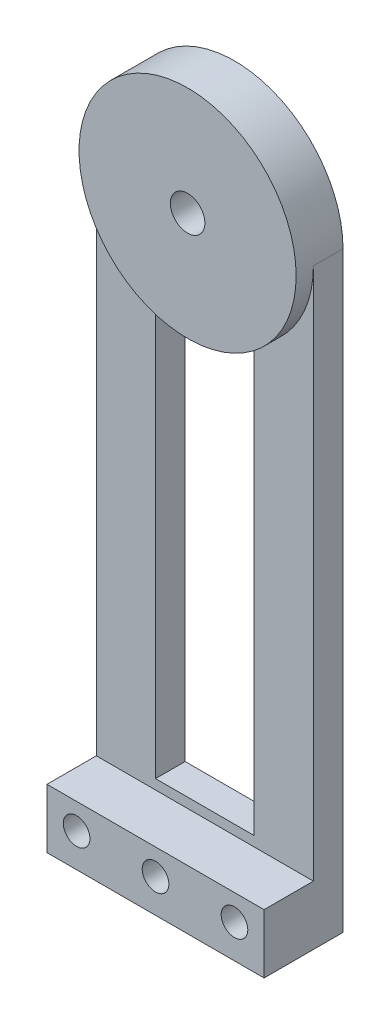
ISO-10303-21;
HEADER;
FILE_DESCRIPTION(('STEP AP214'),'2;1');
FILE_NAME('part.step','',(''),(''),'','','');
FILE_SCHEMA(('AUTOMOTIVE_DESIGN { 1 0 10303 214 1 1 1 1 }'));
ENDSEC;
DATA;
#1=APPLICATION_CONTEXT('core data for automotive mechanical design processes');
#2=APPLICATION_PROTOCOL_DEFINITION('international standard','automotive_design',2000,#1);
#3=PRODUCT_CONTEXT('',#1,'mechanical');
#4=PRODUCT('Part','Part','',(#3));
#5=PRODUCT_RELATED_PRODUCT_CATEGORY('part','',(#4));
#6=PRODUCT_DEFINITION_FORMATION('','',#4);
#7=PRODUCT_DEFINITION_CONTEXT('part definition',#1,'design');
#8=PRODUCT_DEFINITION('design','',#6,#7);
#9=PRODUCT_DEFINITION_SHAPE('','',#8);
#10=(LENGTH_UNIT() NAMED_UNIT(*) SI_UNIT(.MILLI.,.METRE.));
#11=(NAMED_UNIT(*) PLANE_ANGLE_UNIT() SI_UNIT($,.RADIAN.));
#12=(NAMED_UNIT(*) SI_UNIT($,.STERADIAN.) SOLID_ANGLE_UNIT());
#13=UNCERTAINTY_MEASURE_WITH_UNIT(LENGTH_MEASURE(1.E-05),#10,'distance_accuracy_value','');
#14=(GEOMETRIC_REPRESENTATION_CONTEXT(3) GLOBAL_UNCERTAINTY_ASSIGNED_CONTEXT((#13)) GLOBAL_UNIT_ASSIGNED_CONTEXT((#10,
#11,#12)) REPRESENTATION_CONTEXT('',''));
#15=CARTESIAN_POINT('',(0.,0.,0.));
#16=DIRECTION('',(0.,0.,1.));
#17=DIRECTION('',(1.,0.,0.));
#18=AXIS2_PLACEMENT_3D('',#15,#16,#17);
#19=CARTESIAN_POINT('',(0.,0.,0.));
#20=DIRECTION('',(0.,0.,-1.));
#21=DIRECTION('',(1.,0.,0.));
#22=AXIS2_PLACEMENT_3D('',#19,#20,#21);
#23=PLANE('',#22);
#24=CARTESIAN_POINT('',(0.,30.,0.));
#25=DIRECTION('',(0.,0.,1.));
#26=DIRECTION('',(1.,0.,0.));
#27=AXIS2_PLACEMENT_3D('',#24,#25,#26);
#28=CIRCLE('',#27,11.5);
#29=CARTESIAN_POINT('',(-5.,19.643842411396,0.));
#30=VERTEX_POINT('',#29);
#31=CARTESIAN_POINT('',(5.,19.643842411396,0.));
#32=VERTEX_POINT('',#31);
#33=EDGE_CURVE('E158',#30,#32,#28,.T.);
#34=ORIENTED_EDGE('',*,*,#33,.T.);
#35=DIRECTION('',(0.,-1.,0.));
#36=VECTOR('',#35,1.);
#37=CARTESIAN_POINT('',(5.,0.,0.));
#38=LINE('',#37,#36);
#39=CARTESIAN_POINT('',(5.00000000000001,-23.,0.));
#40=VERTEX_POINT('',#39);
#41=EDGE_CURVE('E176',#32,#40,#38,.T.);
#42=ORIENTED_EDGE('',*,*,#41,.T.);
#43=DIRECTION('',(1.,0.,0.));
#44=VECTOR('',#43,1.);
#45=CARTESIAN_POINT('',(0.,-23.,0.));
#46=LINE('',#45,#44);
#47=CARTESIAN_POINT('',(-5.00000000000001,-23.,0.));
#48=VERTEX_POINT('',#47);
#49=EDGE_CURVE('E230',#48,#40,#46,.T.);
#50=ORIENTED_EDGE('',*,*,#49,.F.);
#51=DIRECTION('',(0.,-1.,0.));
#52=VECTOR('',#51,1.);
#53=CARTESIAN_POINT('',(-5.,0.,0.));
#54=LINE('',#53,#52);
#55=EDGE_CURVE('E233',#30,#48,#54,.T.);
#56=ORIENTED_EDGE('',*,*,#55,.F.);
#57=EDGE_LOOP('',(#34,#42,#50,#56));
#58=FACE_BOUND('',#57,.T.);
#59=DIRECTION('',(1.,0.,0.));
#60=VECTOR('',#59,1.);
#61=CARTESIAN_POINT('',(0.,-24.,0.));
#62=LINE('',#61,#60);
#63=CARTESIAN_POINT('',(-11.,-24.,0.));
#64=VERTEX_POINT('',#63);
#65=CARTESIAN_POINT('',(11.,-24.,0.));
#66=VERTEX_POINT('',#65);
#67=EDGE_CURVE('E204',#64,#66,#62,.T.);
#68=ORIENTED_EDGE('',*,*,#67,.T.);
#69=DIRECTION('',(0.,-1.,0.));
#70=VECTOR('',#69,1.);
#71=CARTESIAN_POINT('',(11.,0.,0.));
#72=LINE('',#71,#70);
#73=CARTESIAN_POINT('',(11.,30.,0.));
#74=VERTEX_POINT('',#73);
#75=EDGE_CURVE('E235',#74,#66,#72,.T.);
#76=ORIENTED_EDGE('',*,*,#75,.F.);
#77=CARTESIAN_POINT('',(0.,30.,0.));
#78=DIRECTION('',(0.,0.,1.));
#79=DIRECTION('',(1.,0.,0.));
#80=AXIS2_PLACEMENT_3D('',#77,#78,#79);
#81=CIRCLE('',#80,11.);
#82=CARTESIAN_POINT('',(-11.,30.,0.));
#83=VERTEX_POINT('',#82);
#84=EDGE_CURVE('E13',#83,#74,#81,.T.);
#85=ORIENTED_EDGE('',*,*,#84,.F.);
#86=DIRECTION('',(0.,-1.,0.));
#87=VECTOR('',#86,1.);
#88=CARTESIAN_POINT('',(-11.,0.,0.));
#89=LINE('',#88,#87);
#90=EDGE_CURVE('E153',#83,#64,#89,.T.);
#91=ORIENTED_EDGE('',*,*,#90,.T.);
#92=EDGE_LOOP('',(#68,#76,#85,#91));
#93=FACE_BOUND('',#92,.T.);
#94=ADVANCED_FACE('F61',(#58,#93),#23,.F.);
#95=CARTESIAN_POINT('',(0.,30.,6.69974746830584));
#96=DIRECTION('',(0.,0.,-1.));
#97=DIRECTION('',(1.,0.,0.));
#98=AXIS2_PLACEMENT_3D('',#95,#96,#97);
#99=CYLINDRICAL_SURFACE('',#98,1.75);
#100=CARTESIAN_POINT('',(0.,30.,1.75));
#101=DIRECTION('',(0.,0.,1.));
#102=DIRECTION('',(1.,0.,0.));
#103=AXIS2_PLACEMENT_3D('',#100,#101,#102);
#104=CIRCLE('',#103,1.75);
#105=CARTESIAN_POINT('',(1.74999999999999,30.,1.75));
#106=VERTEX_POINT('',#105);
#107=EDGE_CURVE('E219',#106,#106,#104,.F.);
#108=ORIENTED_EDGE('',*,*,#107,.F.);
#109=EDGE_LOOP('',(#108));
#110=FACE_BOUND('',#109,.T.);
#111=CARTESIAN_POINT('',(0.,30.,-1.25));
#112=DIRECTION('',(0.,0.,1.));
#113=DIRECTION('',(1.,0.,0.));
#114=AXIS2_PLACEMENT_3D('',#111,#112,#113);
#115=CIRCLE('',#114,1.75);
#116=CARTESIAN_POINT('',(1.74999999999999,30.,-1.25));
#117=VERTEX_POINT('',#116);
#118=EDGE_CURVE('E209',#117,#117,#115,.F.);
#119=ORIENTED_EDGE('',*,*,#118,.T.);
#120=EDGE_LOOP('',(#119));
#121=FACE_BOUND('',#120,.T.);
#122=ADVANCED_FACE('F309',(#110,#121),#99,.F.);
#123=CARTESIAN_POINT('',(11.,0.,-3.));
#124=DIRECTION('',(1.,0.,0.));
#125=DIRECTION('',(0.,0.,1.));
#126=AXIS2_PLACEMENT_3D('',#123,#124,#125);
#127=PLANE('',#126);
#128=ORIENTED_EDGE('',*,*,#75,.T.);
#129=DIRECTION('',(0.,0.,-1.));
#130=VECTOR('',#129,1.);
#131=CARTESIAN_POINT('',(11.,-24.,5.));
#132=LINE('',#131,#130);
#133=CARTESIAN_POINT('',(11.,-24.,5.));
#134=VERTEX_POINT('',#133);
#135=EDGE_CURVE('E193',#134,#66,#132,.T.);
#136=ORIENTED_EDGE('',*,*,#135,.F.);
#137=DIRECTION('',(0.,-1.,0.));
#138=VECTOR('',#137,1.);
#139=CARTESIAN_POINT('',(11.,0.,5.));
#140=LINE('',#139,#138);
#141=CARTESIAN_POINT('',(11.,-30.,5.));
#142=VERTEX_POINT('',#141);
#143=EDGE_CURVE('E189',#134,#142,#140,.T.);
#144=ORIENTED_EDGE('',*,*,#143,.T.);
#145=DIRECTION('',(0.,0.,1.));
#146=VECTOR('',#145,1.);
#147=CARTESIAN_POINT('',(11.,-30.,-3.));
#148=LINE('',#147,#146);
#149=CARTESIAN_POINT('',(11.,-30.,-3.));
#150=VERTEX_POINT('',#149);
#151=EDGE_CURVE('E65',#150,#142,#148,.T.);
#152=ORIENTED_EDGE('',*,*,#151,.F.);
#153=DIRECTION('',(0.,-1.,0.));
#154=VECTOR('',#153,1.);
#155=CARTESIAN_POINT('',(11.,0.,-3.));
#156=LINE('',#155,#154);
#157=CARTESIAN_POINT('',(11.,30.,-3.));
#158=VERTEX_POINT('',#157);
#159=EDGE_CURVE('E143',#158,#150,#156,.T.);
#160=ORIENTED_EDGE('',*,*,#159,.F.);
#161=DIRECTION('',(0.,0.,1.));
#162=VECTOR('',#161,1.);
#163=CARTESIAN_POINT('',(11.,30.,-3.));
#164=LINE('',#163,#162);
#165=EDGE_CURVE('E71',#158,#74,#164,.T.);
#166=ORIENTED_EDGE('',*,*,#165,.T.);
#167=EDGE_LOOP('',(#128,#136,#144,#152,#160,#166));
#168=FACE_BOUND('',#167,.T.);
#169=ADVANCED_FACE('F191',(#168),#127,.T.);
#170=CARTESIAN_POINT('',(0.,30.,-3.));
#171=DIRECTION('',(0.,0.,1.));
#172=DIRECTION('',(-1.,0.,0.));
#173=AXIS2_PLACEMENT_3D('',#170,#171,#172);
#174=CYLINDRICAL_SURFACE('',#173,11.);
#175=ORIENTED_EDGE('',*,*,#165,.F.);
#176=CARTESIAN_POINT('',(0.,30.,-3.));
#177=DIRECTION('',(0.,0.,1.));
#178=DIRECTION('',(1.,0.,0.));
#179=AXIS2_PLACEMENT_3D('',#176,#177,#178);
#180=CIRCLE('',#179,11.);
#181=CARTESIAN_POINT('',(-11.,30.,-3.));
#182=VERTEX_POINT('',#181);
#183=EDGE_CURVE('E162',#158,#182,#180,.T.);
#184=ORIENTED_EDGE('',*,*,#183,.T.);
#185=DIRECTION('',(0.,0.,1.));
#186=VECTOR('',#185,1.);
#187=CARTESIAN_POINT('',(-11.,30.,-3.));
#188=LINE('',#187,#186);
#189=EDGE_CURVE('E114',#182,#83,#188,.T.);
#190=ORIENTED_EDGE('',*,*,#189,.T.);
#191=ORIENTED_EDGE('',*,*,#84,.T.);
#192=EDGE_LOOP('',(#175,#184,#190,#191));
#193=FACE_BOUND('',#192,.T.);
#194=CARTESIAN_POINT('',(0.,30.,1.75));
#195=DIRECTION('',(0.,0.,1.));
#196=DIRECTION('',(1.,0.,0.));
#197=AXIS2_PLACEMENT_3D('',#194,#195,#196);
#198=CIRCLE('',#197,11.);
#199=CARTESIAN_POINT('',(11.,30.,1.75));
#200=VERTEX_POINT('',#199);
#201=EDGE_CURVE('E170',#200,#200,#198,.T.);
#202=ORIENTED_EDGE('',*,*,#201,.F.);
#203=EDGE_LOOP('',(#202));
#204=FACE_BOUND('',#203,.T.);
#205=ADVANCED_FACE('F241',(#193,#204),#174,.T.);
#206=CARTESIAN_POINT('',(0.,30.,-3.));
#207=DIRECTION('',(0.,0.,1.));
#208=DIRECTION('',(-1.,0.,0.));
#209=AXIS2_PLACEMENT_3D('',#206,#207,#208);
#210=CYLINDRICAL_SURFACE('',#209,11.5);
#211=ORIENTED_EDGE('',*,*,#33,.F.);
#212=DIRECTION('',(0.,0.,1.));
#213=VECTOR('',#212,1.);
#214=CARTESIAN_POINT('',(-5.,19.643842411396,-3.));
#215=LINE('',#214,#213);
#216=CARTESIAN_POINT('',(-5.,19.643842411396,-3.));
#217=VERTEX_POINT('',#216);
#218=EDGE_CURVE('E138',#217,#30,#215,.T.);
#219=ORIENTED_EDGE('',*,*,#218,.F.);
#220=CARTESIAN_POINT('',(0.,30.,-3.));
#221=DIRECTION('',(0.,0.,1.));
#222=DIRECTION('',(1.,0.,0.));
#223=AXIS2_PLACEMENT_3D('',#220,#221,#222);
#224=CIRCLE('',#223,11.5);
#225=CARTESIAN_POINT('',(5.,19.643842411396,-3.));
#226=VERTEX_POINT('',#225);
#227=EDGE_CURVE('E147',#217,#226,#224,.T.);
#228=ORIENTED_EDGE('',*,*,#227,.T.);
#229=DIRECTION('',(0.,0.,1.));
#230=VECTOR('',#229,1.);
#231=CARTESIAN_POINT('',(5.,19.643842411396,-3.));
#232=LINE('',#231,#230);
#233=EDGE_CURVE('E168',#226,#32,#232,.T.);
#234=ORIENTED_EDGE('',*,*,#233,.T.);
#235=EDGE_LOOP('',(#211,#219,#228,#234));
#236=FACE_BOUND('',#235,.T.);
#237=ADVANCED_FACE('F156',(#236),#210,.T.);
#238=CARTESIAN_POINT('',(5.,0.,-3.));
#239=DIRECTION('',(1.,0.,0.));
#240=DIRECTION('',(0.,1.,0.));
#241=AXIS2_PLACEMENT_3D('',#238,#239,#240);
#242=PLANE('',#241);
#243=ORIENTED_EDGE('',*,*,#41,.F.);
#244=ORIENTED_EDGE('',*,*,#233,.F.);
#245=DIRECTION('',(0.,-1.,0.));
#246=VECTOR('',#245,1.);
#247=CARTESIAN_POINT('',(5.,0.,-3.));
#248=LINE('',#247,#246);
#249=CARTESIAN_POINT('',(5.00000000000001,-23.,-3.));
#250=VERTEX_POINT('',#249);
#251=EDGE_CURVE('E150',#226,#250,#248,.T.);
#252=ORIENTED_EDGE('',*,*,#251,.T.);
#253=DIRECTION('',(0.,0.,1.));
#254=VECTOR('',#253,1.);
#255=CARTESIAN_POINT('',(5.00000000000001,-23.,-3.));
#256=LINE('',#255,#254);
#257=EDGE_CURVE('E160',#250,#40,#256,.T.);
#258=ORIENTED_EDGE('',*,*,#257,.T.);
#259=EDGE_LOOP('',(#243,#244,#252,#258));
#260=FACE_BOUND('',#259,.T.);
#261=ADVANCED_FACE('F329',(#260),#242,.F.);
#262=CARTESIAN_POINT('',(0.,-23.,-3.));
#263=DIRECTION('',(0.,1.,0.));
#264=DIRECTION('',(0.,0.,-1.));
#265=AXIS2_PLACEMENT_3D('',#262,#263,#264);
#266=PLANE('',#265);
#267=ORIENTED_EDGE('',*,*,#49,.T.);
#268=ORIENTED_EDGE('',*,*,#257,.F.);
#269=DIRECTION('',(1.,0.,0.));
#270=VECTOR('',#269,1.);
#271=CARTESIAN_POINT('',(0.,-23.,-3.));
#272=LINE('',#271,#270);
#273=CARTESIAN_POINT('',(-5.00000000000001,-23.,-3.));
#274=VERTEX_POINT('',#273);
#275=EDGE_CURVE('E144',#274,#250,#272,.T.);
#276=ORIENTED_EDGE('',*,*,#275,.F.);
#277=DIRECTION('',(0.,0.,1.));
#278=VECTOR('',#277,1.);
#279=CARTESIAN_POINT('',(-5.00000000000001,-23.,-3.));
#280=LINE('',#279,#278);
#281=EDGE_CURVE('E140',#274,#48,#280,.T.);
#282=ORIENTED_EDGE('',*,*,#281,.T.);
#283=EDGE_LOOP('',(#267,#268,#276,#282));
#284=FACE_BOUND('',#283,.T.);
#285=ADVANCED_FACE('F326',(#284),#266,.T.);
#286=CARTESIAN_POINT('',(-5.,0.,-3.));
#287=DIRECTION('',(1.,0.,0.));
#288=DIRECTION('',(0.,1.,0.));
#289=AXIS2_PLACEMENT_3D('',#286,#287,#288);
#290=PLANE('',#289);
#291=ORIENTED_EDGE('',*,*,#55,.T.);
#292=ORIENTED_EDGE('',*,*,#281,.F.);
#293=DIRECTION('',(0.,-1.,0.));
#294=VECTOR('',#293,1.);
#295=CARTESIAN_POINT('',(-5.,0.,-3.));
#296=LINE('',#295,#294);
#297=EDGE_CURVE('E133',#217,#274,#296,.T.);
#298=ORIENTED_EDGE('',*,*,#297,.F.);
#299=ORIENTED_EDGE('',*,*,#218,.T.);
#300=EDGE_LOOP('',(#291,#292,#298,#299));
#301=FACE_BOUND('',#300,.T.);
#302=ADVANCED_FACE('F136',(#301),#290,.T.);
#303=CARTESIAN_POINT('',(-11.,0.,-3.));
#304=DIRECTION('',(1.,0.,0.));
#305=DIRECTION('',(0.,0.,1.));
#306=AXIS2_PLACEMENT_3D('',#303,#304,#305);
#307=PLANE('',#306);
#308=ORIENTED_EDGE('',*,*,#90,.F.);
#309=ORIENTED_EDGE('',*,*,#189,.F.);
#310=DIRECTION('',(0.,-1.,0.));
#311=VECTOR('',#310,1.);
#312=CARTESIAN_POINT('',(-11.,0.,-3.));
#313=LINE('',#312,#311);
#314=CARTESIAN_POINT('',(-11.,-30.,-3.));
#315=VERTEX_POINT('',#314);
#316=EDGE_CURVE('E80',#182,#315,#313,.T.);
#317=ORIENTED_EDGE('',*,*,#316,.T.);
#318=DIRECTION('',(0.,0.,1.));
#319=VECTOR('',#318,1.);
#320=CARTESIAN_POINT('',(-11.,-30.,-3.));
#321=LINE('',#320,#319);
#322=CARTESIAN_POINT('',(-11.,-30.,5.));
#323=VERTEX_POINT('',#322);
#324=EDGE_CURVE('E171',#315,#323,#321,.T.);
#325=ORIENTED_EDGE('',*,*,#324,.T.);
#326=DIRECTION('',(0.,-1.,0.));
#327=VECTOR('',#326,1.);
#328=CARTESIAN_POINT('',(-11.,0.,5.));
#329=LINE('',#328,#327);
#330=CARTESIAN_POINT('',(-11.,-24.,5.));
#331=VERTEX_POINT('',#330);
#332=EDGE_CURVE('E200',#331,#323,#329,.T.);
#333=ORIENTED_EDGE('',*,*,#332,.F.);
#334=DIRECTION('',(0.,0.,-1.));
#335=VECTOR('',#334,1.);
#336=CARTESIAN_POINT('',(-11.,-24.,5.));
#337=LINE('',#336,#335);
#338=EDGE_CURVE('E196',#331,#64,#337,.T.);
#339=ORIENTED_EDGE('',*,*,#338,.T.);
#340=EDGE_LOOP('',(#308,#309,#317,#325,#333,#339));
#341=FACE_BOUND('',#340,.T.);
#342=ADVANCED_FACE('F284',(#341),#307,.F.);
#343=CARTESIAN_POINT('',(0.,0.,-3.));
#344=DIRECTION('',(0.,0.,-1.));
#345=DIRECTION('',(1.,0.,0.));
#346=AXIS2_PLACEMENT_3D('',#343,#344,#345);
#347=PLANE('',#346);
#348=CARTESIAN_POINT('',(8.,-26.6,-3.));
#349=DIRECTION('',(0.,0.,1.));
#350=DIRECTION('',(1.,0.,0.));
#351=AXIS2_PLACEMENT_3D('',#348,#349,#350);
#352=CIRCLE('',#351,1.35);
#353=CARTESIAN_POINT('',(9.35,-26.6,-3.));
#354=VERTEX_POINT('',#353);
#355=EDGE_CURVE('E260',#354,#354,#352,.T.);
#356=ORIENTED_EDGE('',*,*,#355,.T.);
#357=EDGE_LOOP('',(#356));
#358=FACE_BOUND('',#357,.T.);
#359=CARTESIAN_POINT('',(-8.,-26.6,-3.));
#360=DIRECTION('',(0.,0.,1.));
#361=DIRECTION('',(1.,0.,0.));
#362=AXIS2_PLACEMENT_3D('',#359,#360,#361);
#363=CIRCLE('',#362,1.35);
#364=CARTESIAN_POINT('',(-6.65,-26.6,-3.));
#365=VERTEX_POINT('',#364);
#366=EDGE_CURVE('E261',#365,#365,#363,.T.);
#367=ORIENTED_EDGE('',*,*,#366,.T.);
#368=EDGE_LOOP('',(#367));
#369=FACE_BOUND('',#368,.T.);
#370=CARTESIAN_POINT('',(0.,-26.6,-3.));
#371=DIRECTION('',(0.,0.,1.));
#372=DIRECTION('',(1.,0.,0.));
#373=AXIS2_PLACEMENT_3D('',#370,#371,#372);
#374=CIRCLE('',#373,1.35);
#375=CARTESIAN_POINT('',(1.35,-26.6,-3.));
#376=VERTEX_POINT('',#375);
#377=EDGE_CURVE('E257',#376,#376,#374,.T.);
#378=ORIENTED_EDGE('',*,*,#377,.T.);
#379=EDGE_LOOP('',(#378));
#380=FACE_BOUND('',#379,.T.);
#381=CARTESIAN_POINT('',(0.,30.,-3.));
#382=DIRECTION('',(0.,0.,1.));
#383=DIRECTION('',(1.,0.,0.));
#384=AXIS2_PLACEMENT_3D('',#381,#382,#383);
#385=CIRCLE('',#384,3.);
#386=CARTESIAN_POINT('',(2.99999999999999,30.,-3.));
#387=VERTEX_POINT('',#386);
#388=EDGE_CURVE('E211',#387,#387,#385,.T.);
#389=ORIENTED_EDGE('',*,*,#388,.T.);
#390=EDGE_LOOP('',(#389));
#391=FACE_BOUND('',#390,.T.);
#392=ORIENTED_EDGE('',*,*,#227,.F.);
#393=ORIENTED_EDGE('',*,*,#297,.T.);
#394=ORIENTED_EDGE('',*,*,#275,.T.);
#395=ORIENTED_EDGE('',*,*,#251,.F.);
#396=EDGE_LOOP('',(#392,#393,#394,#395));
#397=FACE_BOUND('',#396,.T.);
#398=ORIENTED_EDGE('',*,*,#316,.F.);
#399=ORIENTED_EDGE('',*,*,#183,.F.);
#400=ORIENTED_EDGE('',*,*,#159,.T.);
#401=DIRECTION('',(1.,0.,0.));
#402=VECTOR('',#401,1.);
#403=CARTESIAN_POINT('',(-11.,-30.,-3.));
#404=LINE('',#403,#402);
#405=EDGE_CURVE('E107',#315,#150,#404,.T.);
#406=ORIENTED_EDGE('',*,*,#405,.F.);
#407=EDGE_LOOP('',(#398,#399,#400,#406));
#408=FACE_BOUND('',#407,.T.);
#409=ADVANCED_FACE('F148',(#358,#369,#380,#391,#397,#408),#347,.T.);
#410=CARTESIAN_POINT('',(-11.,-30.,-3.));
#411=DIRECTION('',(0.,1.,0.));
#412=DIRECTION('',(0.,0.,-1.));
#413=AXIS2_PLACEMENT_3D('',#410,#411,#412);
#414=PLANE('',#413);
#415=ORIENTED_EDGE('',*,*,#324,.F.);
#416=ORIENTED_EDGE('',*,*,#405,.T.);
#417=ORIENTED_EDGE('',*,*,#151,.T.);
#418=DIRECTION('',(1.,0.,0.));
#419=VECTOR('',#418,1.);
#420=CARTESIAN_POINT('',(0.,-30.,5.));
#421=LINE('',#420,#419);
#422=EDGE_CURVE('E182',#323,#142,#421,.T.);
#423=ORIENTED_EDGE('',*,*,#422,.F.);
#424=EDGE_LOOP('',(#415,#416,#417,#423));
#425=FACE_BOUND('',#424,.T.);
#426=ADVANCED_FACE('F63',(#425),#414,.F.);
#427=CARTESIAN_POINT('',(0.,0.,1.75));
#428=DIRECTION('',(0.,0.,-1.));
#429=DIRECTION('',(1.,0.,0.));
#430=AXIS2_PLACEMENT_3D('',#427,#428,#429);
#431=PLANE('',#430);
#432=ORIENTED_EDGE('',*,*,#107,.T.);
#433=EDGE_LOOP('',(#432));
#434=FACE_BOUND('',#433,.T.);
#435=ORIENTED_EDGE('',*,*,#201,.T.);
#436=EDGE_LOOP('',(#435));
#437=FACE_BOUND('',#436,.T.);
#438=ADVANCED_FACE('F295',(#434,#437),#431,.F.);
#439=CARTESIAN_POINT('',(0.,30.,10.2352813742386));
#440=DIRECTION('',(0.,0.,-1.));
#441=DIRECTION('',(1.,0.,0.));
#442=AXIS2_PLACEMENT_3D('',#439,#440,#441);
#443=CYLINDRICAL_SURFACE('',#442,3.);
#444=CARTESIAN_POINT('',(0.,30.,-1.25));
#445=DIRECTION('',(0.,0.,1.));
#446=DIRECTION('',(1.,0.,0.));
#447=AXIS2_PLACEMENT_3D('',#444,#445,#446);
#448=CIRCLE('',#447,3.);
#449=CARTESIAN_POINT('',(2.99999999999999,30.,-1.25));
#450=VERTEX_POINT('',#449);
#451=EDGE_CURVE('E214',#450,#450,#448,.F.);
#452=ORIENTED_EDGE('',*,*,#451,.F.);
#453=EDGE_LOOP('',(#452));
#454=FACE_BOUND('',#453,.T.);
#455=ORIENTED_EDGE('',*,*,#388,.F.);
#456=EDGE_LOOP('',(#455));
#457=FACE_BOUND('',#456,.T.);
#458=ADVANCED_FACE('F292',(#454,#457),#443,.F.);
#459=CARTESIAN_POINT('',(0.,0.,-1.25));
#460=DIRECTION('',(0.,0.,-1.));
#461=DIRECTION('',(1.,0.,0.));
#462=AXIS2_PLACEMENT_3D('',#459,#460,#461);
#463=PLANE('',#462);
#464=ORIENTED_EDGE('',*,*,#451,.T.);
#465=EDGE_LOOP('',(#464));
#466=FACE_BOUND('',#465,.T.);
#467=ORIENTED_EDGE('',*,*,#118,.F.);
#468=EDGE_LOOP('',(#467));
#469=FACE_BOUND('',#468,.T.);
#470=ADVANCED_FACE('F294',(#466,#469),#463,.T.);
#471=CARTESIAN_POINT('',(0.,-24.,5.));
#472=DIRECTION('',(0.,-1.,0.));
#473=DIRECTION('',(0.,0.,1.));
#474=AXIS2_PLACEMENT_3D('',#471,#472,#473);
#475=PLANE('',#474);
#476=ORIENTED_EDGE('',*,*,#67,.F.);
#477=ORIENTED_EDGE('',*,*,#338,.F.);
#478=DIRECTION('',(1.,0.,0.));
#479=VECTOR('',#478,1.);
#480=CARTESIAN_POINT('',(0.,-24.,5.));
#481=LINE('',#480,#479);
#482=EDGE_CURVE('E207',#331,#134,#481,.T.);
#483=ORIENTED_EDGE('',*,*,#482,.T.);
#484=ORIENTED_EDGE('',*,*,#135,.T.);
#485=EDGE_LOOP('',(#476,#477,#483,#484));
#486=FACE_BOUND('',#485,.T.);
#487=ADVANCED_FACE('F249',(#486),#475,.F.);
#488=CARTESIAN_POINT('',(0.,0.,5.));
#489=DIRECTION('',(0.,0.,-1.));
#490=DIRECTION('',(1.,0.,0.));
#491=AXIS2_PLACEMENT_3D('',#488,#489,#490);
#492=PLANE('',#491);
#493=CARTESIAN_POINT('',(8.,-26.6,5.));
#494=DIRECTION('',(0.,0.,1.));
#495=DIRECTION('',(1.,0.,0.));
#496=AXIS2_PLACEMENT_3D('',#493,#494,#495);
#497=CIRCLE('',#496,1.35);
#498=CARTESIAN_POINT('',(9.35,-26.6,5.));
#499=VERTEX_POINT('',#498);
#500=EDGE_CURVE('E264',#499,#499,#497,.F.);
#501=ORIENTED_EDGE('',*,*,#500,.T.);
#502=EDGE_LOOP('',(#501));
#503=FACE_BOUND('',#502,.T.);
#504=CARTESIAN_POINT('',(-8.,-26.6,5.));
#505=DIRECTION('',(0.,0.,1.));
#506=DIRECTION('',(1.,0.,0.));
#507=AXIS2_PLACEMENT_3D('',#504,#505,#506);
#508=CIRCLE('',#507,1.35);
#509=CARTESIAN_POINT('',(-6.65,-26.6,5.));
#510=VERTEX_POINT('',#509);
#511=EDGE_CURVE('E265',#510,#510,#508,.F.);
#512=ORIENTED_EDGE('',*,*,#511,.T.);
#513=EDGE_LOOP('',(#512));
#514=FACE_BOUND('',#513,.T.);
#515=CARTESIAN_POINT('',(0.,-26.6,5.));
#516=DIRECTION('',(0.,0.,1.));
#517=DIRECTION('',(1.,0.,0.));
#518=AXIS2_PLACEMENT_3D('',#515,#516,#517);
#519=CIRCLE('',#518,1.35);
#520=CARTESIAN_POINT('',(1.35,-26.6,5.));
#521=VERTEX_POINT('',#520);
#522=EDGE_CURVE('E208',#521,#521,#519,.F.);
#523=ORIENTED_EDGE('',*,*,#522,.T.);
#524=EDGE_LOOP('',(#523));
#525=FACE_BOUND('',#524,.T.);
#526=ORIENTED_EDGE('',*,*,#482,.F.);
#527=ORIENTED_EDGE('',*,*,#332,.T.);
#528=ORIENTED_EDGE('',*,*,#422,.T.);
#529=ORIENTED_EDGE('',*,*,#143,.F.);
#530=EDGE_LOOP('',(#526,#527,#528,#529));
#531=FACE_BOUND('',#530,.T.);
#532=ADVANCED_FACE('F252',(#503,#514,#525,#531),#492,.F.);
#533=CARTESIAN_POINT('',(0.,-26.6,8.81837661840736));
#534=DIRECTION('',(0.,0.,-1.));
#535=DIRECTION('',(1.,0.,0.));
#536=AXIS2_PLACEMENT_3D('',#533,#534,#535);
#537=CYLINDRICAL_SURFACE('',#536,1.35);
#538=CARTESIAN_POINT('',(1.35,-26.6,5.));
#539=CARTESIAN_POINT('',(1.35,-26.6,4.91666666666667));
#540=CARTESIAN_POINT('',(1.35,-26.6,4.83333333333333));
#541=CARTESIAN_POINT('',(1.35,-26.6,4.66666666666667));
#542=CARTESIAN_POINT('',(1.35,-26.6,4.58333333333333));
#543=CARTESIAN_POINT('',(1.35,-26.6,4.41666666666667));
#544=CARTESIAN_POINT('',(1.35,-26.6,4.33333333333333));
#545=CARTESIAN_POINT('',(1.35,-26.6,4.16666666666667));
#546=CARTESIAN_POINT('',(1.35,-26.6,4.08333333333333));
#547=CARTESIAN_POINT('',(1.35,-26.6,3.91666666666667));
#548=CARTESIAN_POINT('',(1.35,-26.6,3.83333333333333));
#549=CARTESIAN_POINT('',(1.35,-26.6,3.66666666666667));
#550=CARTESIAN_POINT('',(1.35,-26.6,3.58333333333333));
#551=CARTESIAN_POINT('',(1.35,-26.6,3.41666666666667));
#552=CARTESIAN_POINT('',(1.35,-26.6,3.33333333333333));
#553=CARTESIAN_POINT('',(1.35,-26.6,3.16666666666667));
#554=CARTESIAN_POINT('',(1.35,-26.6,3.08333333333333));
#555=CARTESIAN_POINT('',(1.35,-26.6,2.91666666666667));
#556=CARTESIAN_POINT('',(1.35,-26.6,2.83333333333333));
#557=CARTESIAN_POINT('',(1.35,-26.6,2.66666666666667));
#558=CARTESIAN_POINT('',(1.35,-26.6,2.58333333333333));
#559=CARTESIAN_POINT('',(1.35,-26.6,2.41666666666667));
#560=CARTESIAN_POINT('',(1.35,-26.6,2.33333333333333));
#561=CARTESIAN_POINT('',(1.35,-26.6,2.16666666666667));
#562=CARTESIAN_POINT('',(1.35,-26.6,2.08333333333333));
#563=CARTESIAN_POINT('',(1.35,-26.6,1.91666666666667));
#564=CARTESIAN_POINT('',(1.35,-26.6,1.83333333333333));
#565=CARTESIAN_POINT('',(1.35,-26.6,1.66666666666667));
#566=CARTESIAN_POINT('',(1.35,-26.6,1.58333333333333));
#567=CARTESIAN_POINT('',(1.35,-26.6,1.41666666666667));
#568=CARTESIAN_POINT('',(1.35,-26.6,1.33333333333333));
#569=CARTESIAN_POINT('',(1.35,-26.6,1.16666666666667));
#570=CARTESIAN_POINT('',(1.35,-26.6,1.08333333333333));
#571=CARTESIAN_POINT('',(1.35,-26.6,0.916666666666666));
#572=CARTESIAN_POINT('',(1.35,-26.6,0.833333333333332));
#573=CARTESIAN_POINT('',(1.35,-26.6,0.666666666666666));
#574=CARTESIAN_POINT('',(1.35,-26.6,0.583333333333332));
#575=CARTESIAN_POINT('',(1.35,-26.6,0.416666666666666));
#576=CARTESIAN_POINT('',(1.35,-26.6,0.333333333333333));
#577=CARTESIAN_POINT('',(1.35,-26.6,0.166666666666667));
#578=CARTESIAN_POINT('',(1.35,-26.6,0.0833333333333334));
#579=CARTESIAN_POINT('',(1.35,-26.6,-0.0833333333333334));
#580=CARTESIAN_POINT('',(1.35,-26.6,-0.166666666666667));
#581=CARTESIAN_POINT('',(1.35,-26.6,-0.333333333333334));
#582=CARTESIAN_POINT('',(1.35,-26.6,-0.416666666666667));
#583=CARTESIAN_POINT('',(1.35,-26.6,-0.583333333333334));
#584=CARTESIAN_POINT('',(1.35,-26.6,-0.666666666666667));
#585=CARTESIAN_POINT('',(1.35,-26.6,-0.833333333333334));
#586=CARTESIAN_POINT('',(1.35,-26.6,-0.916666666666668));
#587=CARTESIAN_POINT('',(1.35,-26.6,-1.08333333333333));
#588=CARTESIAN_POINT('',(1.35,-26.6,-1.16666666666667));
#589=CARTESIAN_POINT('',(1.35,-26.6,-1.33333333333333));
#590=CARTESIAN_POINT('',(1.35,-26.6,-1.41666666666667));
#591=CARTESIAN_POINT('',(1.35,-26.6,-1.58333333333333));
#592=CARTESIAN_POINT('',(1.35,-26.6,-1.66666666666667));
#593=CARTESIAN_POINT('',(1.35,-26.6,-1.83333333333333));
#594=CARTESIAN_POINT('',(1.35,-26.6,-1.91666666666667));
#595=CARTESIAN_POINT('',(1.35,-26.6,-2.08333333333333));
#596=CARTESIAN_POINT('',(1.35,-26.6,-2.16666666666667));
#597=CARTESIAN_POINT('',(1.35,-26.6,-2.33333333333333));
#598=CARTESIAN_POINT('',(1.35,-26.6,-2.41666666666667));
#599=CARTESIAN_POINT('',(1.35,-26.6,-2.58333333333333));
#600=CARTESIAN_POINT('',(1.35,-26.6,-2.66666666666667));
#601=CARTESIAN_POINT('',(1.35,-26.6,-2.83333333333333));
#602=CARTESIAN_POINT('',(1.35,-26.6,-2.91666666666667));
#603=CARTESIAN_POINT('',(1.35,-26.6,-3.));
#604=B_SPLINE_CURVE_WITH_KNOTS('',3,(#538,#539,#540,#541,#542,#543,#544,#545,#546,#547,#548,
#549,#550,#551,#552,#553,#554,#555,#556,#557,#558,#559,#560,#561,#562,#563,#564,#565,#566,#567,
#568,#569,#570,#571,#572,#573,#574,#575,#576,#577,#578,#579,#580,#581,#582,#583,#584,#585,#586,
#587,#588,#589,#590,#591,#592,#593,#594,#595,#596,#597,#598,#599,#600,#601,#602,#603),
.UNSPECIFIED.,.F.,.F.,(4,2,2,2,2,2,2,2,2,2,2,2,2,2,2,2,2,2,2,2,2,2,2,2,2,2,2,2,2,2,2,2,4),(0.,
0.249999999999999,0.5,0.75,0.999999999999999,1.25,1.5,1.75,2.,2.25,2.5,2.75,3.,3.25,3.5,3.75,4.,
4.25,4.5,4.75,5.,5.25,5.5,5.75,6.,6.25,6.5,6.75,7.,7.25,7.5,7.75,8.),.UNSPECIFIED.);
#605=EDGE_CURVE('BSEAM395',#521,#376,#604,.T.);
#606=ORIENTED_EDGE('',*,*,#522,.F.);
#607=ORIENTED_EDGE('',*,*,#377,.F.);
#608=ORIENTED_EDGE('',*,*,#605,.T.);
#609=ORIENTED_EDGE('',*,*,#605,.F.);
#610=EDGE_LOOP('',(#606,#608,#607,#609));
#611=FACE_BOUND('',#610,.T.);
#612=ADVANCED_FACE('F395',(#611),#537,.F.);
#613=CARTESIAN_POINT('',(-8.,-26.6,8.81837661840736));
#614=DIRECTION('',(0.,0.,-1.));
#615=DIRECTION('',(1.,0.,0.));
#616=AXIS2_PLACEMENT_3D('',#613,#614,#615);
#617=CYLINDRICAL_SURFACE('',#616,1.35);
#618=CARTESIAN_POINT('',(-6.65,-26.6,5.));
#619=CARTESIAN_POINT('',(-6.65,-26.6,4.91666666666667));
#620=CARTESIAN_POINT('',(-6.65,-26.6,4.83333333333333));
#621=CARTESIAN_POINT('',(-6.65,-26.6,4.66666666666667));
#622=CARTESIAN_POINT('',(-6.65,-26.6,4.58333333333333));
#623=CARTESIAN_POINT('',(-6.65,-26.6,4.41666666666667));
#624=CARTESIAN_POINT('',(-6.65,-26.6,4.33333333333333));
#625=CARTESIAN_POINT('',(-6.65,-26.6,4.16666666666667));
#626=CARTESIAN_POINT('',(-6.65,-26.6,4.08333333333333));
#627=CARTESIAN_POINT('',(-6.65,-26.6,3.91666666666667));
#628=CARTESIAN_POINT('',(-6.65,-26.6,3.83333333333333));
#629=CARTESIAN_POINT('',(-6.65,-26.6,3.66666666666667));
#630=CARTESIAN_POINT('',(-6.65,-26.6,3.58333333333333));
#631=CARTESIAN_POINT('',(-6.65,-26.6,3.41666666666667));
#632=CARTESIAN_POINT('',(-6.65,-26.6,3.33333333333333));
#633=CARTESIAN_POINT('',(-6.65,-26.6,3.16666666666667));
#634=CARTESIAN_POINT('',(-6.65,-26.6,3.08333333333333));
#635=CARTESIAN_POINT('',(-6.65,-26.6,2.91666666666667));
#636=CARTESIAN_POINT('',(-6.65,-26.6,2.83333333333333));
#637=CARTESIAN_POINT('',(-6.65,-26.6,2.66666666666667));
#638=CARTESIAN_POINT('',(-6.65,-26.6,2.58333333333333));
#639=CARTESIAN_POINT('',(-6.65,-26.6,2.41666666666667));
#640=CARTESIAN_POINT('',(-6.65,-26.6,2.33333333333333));
#641=CARTESIAN_POINT('',(-6.65,-26.6,2.16666666666667));
#642=CARTESIAN_POINT('',(-6.65,-26.6,2.08333333333333));
#643=CARTESIAN_POINT('',(-6.65,-26.6,1.91666666666667));
#644=CARTESIAN_POINT('',(-6.65,-26.6,1.83333333333333));
#645=CARTESIAN_POINT('',(-6.65,-26.6,1.66666666666667));
#646=CARTESIAN_POINT('',(-6.65,-26.6,1.58333333333333));
#647=CARTESIAN_POINT('',(-6.65,-26.6,1.41666666666667));
#648=CARTESIAN_POINT('',(-6.65,-26.6,1.33333333333333));
#649=CARTESIAN_POINT('',(-6.65,-26.6,1.16666666666667));
#650=CARTESIAN_POINT('',(-6.65,-26.6,1.08333333333333));
#651=CARTESIAN_POINT('',(-6.65,-26.6,0.916666666666666));
#652=CARTESIAN_POINT('',(-6.65,-26.6,0.833333333333332));
#653=CARTESIAN_POINT('',(-6.65,-26.6,0.666666666666666));
#654=CARTESIAN_POINT('',(-6.65,-26.6,0.583333333333332));
#655=CARTESIAN_POINT('',(-6.65,-26.6,0.416666666666666));
#656=CARTESIAN_POINT('',(-6.65,-26.6,0.333333333333333));
#657=CARTESIAN_POINT('',(-6.65,-26.6,0.166666666666667));
#658=CARTESIAN_POINT('',(-6.65,-26.6,0.0833333333333334));
#659=CARTESIAN_POINT('',(-6.65,-26.6,-0.0833333333333334));
#660=CARTESIAN_POINT('',(-6.65,-26.6,-0.166666666666667));
#661=CARTESIAN_POINT('',(-6.65,-26.6,-0.333333333333334));
#662=CARTESIAN_POINT('',(-6.65,-26.6,-0.416666666666667));
#663=CARTESIAN_POINT('',(-6.65,-26.6,-0.583333333333334));
#664=CARTESIAN_POINT('',(-6.65,-26.6,-0.666666666666667));
#665=CARTESIAN_POINT('',(-6.65,-26.6,-0.833333333333334));
#666=CARTESIAN_POINT('',(-6.65,-26.6,-0.916666666666668));
#667=CARTESIAN_POINT('',(-6.65,-26.6,-1.08333333333333));
#668=CARTESIAN_POINT('',(-6.65,-26.6,-1.16666666666667));
#669=CARTESIAN_POINT('',(-6.65,-26.6,-1.33333333333333));
#670=CARTESIAN_POINT('',(-6.65,-26.6,-1.41666666666667));
#671=CARTESIAN_POINT('',(-6.65,-26.6,-1.58333333333333));
#672=CARTESIAN_POINT('',(-6.65,-26.6,-1.66666666666667));
#673=CARTESIAN_POINT('',(-6.65,-26.6,-1.83333333333333));
#674=CARTESIAN_POINT('',(-6.65,-26.6,-1.91666666666667));
#675=CARTESIAN_POINT('',(-6.65,-26.6,-2.08333333333333));
#676=CARTESIAN_POINT('',(-6.65,-26.6,-2.16666666666667));
#677=CARTESIAN_POINT('',(-6.65,-26.6,-2.33333333333333));
#678=CARTESIAN_POINT('',(-6.65,-26.6,-2.41666666666667));
#679=CARTESIAN_POINT('',(-6.65,-26.6,-2.58333333333333));
#680=CARTESIAN_POINT('',(-6.65,-26.6,-2.66666666666667));
#681=CARTESIAN_POINT('',(-6.65,-26.6,-2.83333333333333));
#682=CARTESIAN_POINT('',(-6.65,-26.6,-2.91666666666667));
#683=CARTESIAN_POINT('',(-6.65,-26.6,-3.));
#684=B_SPLINE_CURVE_WITH_KNOTS('',3,(#618,#619,#620,#621,#622,#623,#624,#625,#626,#627,#628,
#629,#630,#631,#632,#633,#634,#635,#636,#637,#638,#639,#640,#641,#642,#643,#644,#645,#646,#647,
#648,#649,#650,#651,#652,#653,#654,#655,#656,#657,#658,#659,#660,#661,#662,#663,#664,#665,#666,
#667,#668,#669,#670,#671,#672,#673,#674,#675,#676,#677,#678,#679,#680,#681,#682,#683),
.UNSPECIFIED.,.F.,.F.,(4,2,2,2,2,2,2,2,2,2,2,2,2,2,2,2,2,2,2,2,2,2,2,2,2,2,2,2,2,2,2,2,4),(0.,
0.249999999999999,0.5,0.75,0.999999999999999,1.25,1.5,1.75,2.,2.25,2.5,2.75,3.,3.25,3.5,3.75,4.,
4.25,4.5,4.75,5.,5.25,5.5,5.75,6.,6.25,6.5,6.75,7.,7.25,7.5,7.75,8.),.UNSPECIFIED.);
#685=EDGE_CURVE('BSEAM278',#510,#365,#684,.T.);
#686=ORIENTED_EDGE('',*,*,#511,.F.);
#687=ORIENTED_EDGE('',*,*,#366,.F.);
#688=ORIENTED_EDGE('',*,*,#685,.T.);
#689=ORIENTED_EDGE('',*,*,#685,.F.);
#690=EDGE_LOOP('',(#686,#688,#687,#689));
#691=FACE_BOUND('',#690,.T.);
#692=ADVANCED_FACE('F278',(#691),#617,.F.);
#693=CARTESIAN_POINT('',(8.,-26.6,8.81837661840736));
#694=DIRECTION('',(0.,0.,-1.));
#695=DIRECTION('',(1.,0.,0.));
#696=AXIS2_PLACEMENT_3D('',#693,#694,#695);
#697=CYLINDRICAL_SURFACE('',#696,1.35);
#698=CARTESIAN_POINT('',(9.35,-26.6,5.));
#699=CARTESIAN_POINT('',(9.35,-26.6,4.91666666666667));
#700=CARTESIAN_POINT('',(9.35,-26.6,4.83333333333333));
#701=CARTESIAN_POINT('',(9.35,-26.6,4.66666666666667));
#702=CARTESIAN_POINT('',(9.35,-26.6,4.58333333333333));
#703=CARTESIAN_POINT('',(9.35,-26.6,4.41666666666667));
#704=CARTESIAN_POINT('',(9.35,-26.6,4.33333333333333));
#705=CARTESIAN_POINT('',(9.35,-26.6,4.16666666666667));
#706=CARTESIAN_POINT('',(9.35,-26.6,4.08333333333333));
#707=CARTESIAN_POINT('',(9.35,-26.6,3.91666666666667));
#708=CARTESIAN_POINT('',(9.35,-26.6,3.83333333333333));
#709=CARTESIAN_POINT('',(9.35,-26.6,3.66666666666667));
#710=CARTESIAN_POINT('',(9.35,-26.6,3.58333333333333));
#711=CARTESIAN_POINT('',(9.35,-26.6,3.41666666666667));
#712=CARTESIAN_POINT('',(9.35,-26.6,3.33333333333333));
#713=CARTESIAN_POINT('',(9.35,-26.6,3.16666666666667));
#714=CARTESIAN_POINT('',(9.35,-26.6,3.08333333333333));
#715=CARTESIAN_POINT('',(9.35,-26.6,2.91666666666667));
#716=CARTESIAN_POINT('',(9.35,-26.6,2.83333333333333));
#717=CARTESIAN_POINT('',(9.35,-26.6,2.66666666666667));
#718=CARTESIAN_POINT('',(9.35,-26.6,2.58333333333333));
#719=CARTESIAN_POINT('',(9.35,-26.6,2.41666666666667));
#720=CARTESIAN_POINT('',(9.35,-26.6,2.33333333333333));
#721=CARTESIAN_POINT('',(9.35,-26.6,2.16666666666667));
#722=CARTESIAN_POINT('',(9.35,-26.6,2.08333333333333));
#723=CARTESIAN_POINT('',(9.35,-26.6,1.91666666666667));
#724=CARTESIAN_POINT('',(9.35,-26.6,1.83333333333333));
#725=CARTESIAN_POINT('',(9.35,-26.6,1.66666666666667));
#726=CARTESIAN_POINT('',(9.35,-26.6,1.58333333333333));
#727=CARTESIAN_POINT('',(9.35,-26.6,1.41666666666667));
#728=CARTESIAN_POINT('',(9.35,-26.6,1.33333333333333));
#729=CARTESIAN_POINT('',(9.35,-26.6,1.16666666666667));
#730=CARTESIAN_POINT('',(9.35,-26.6,1.08333333333333));
#731=CARTESIAN_POINT('',(9.35,-26.6,0.916666666666666));
#732=CARTESIAN_POINT('',(9.35,-26.6,0.833333333333332));
#733=CARTESIAN_POINT('',(9.35,-26.6,0.666666666666666));
#734=CARTESIAN_POINT('',(9.35,-26.6,0.583333333333332));
#735=CARTESIAN_POINT('',(9.35,-26.6,0.416666666666666));
#736=CARTESIAN_POINT('',(9.35,-26.6,0.333333333333333));
#737=CARTESIAN_POINT('',(9.35,-26.6,0.166666666666667));
#738=CARTESIAN_POINT('',(9.35,-26.6,0.0833333333333334));
#739=CARTESIAN_POINT('',(9.35,-26.6,-0.0833333333333334));
#740=CARTESIAN_POINT('',(9.35,-26.6,-0.166666666666667));
#741=CARTESIAN_POINT('',(9.35,-26.6,-0.333333333333334));
#742=CARTESIAN_POINT('',(9.35,-26.6,-0.416666666666667));
#743=CARTESIAN_POINT('',(9.35,-26.6,-0.583333333333334));
#744=CARTESIAN_POINT('',(9.35,-26.6,-0.666666666666667));
#745=CARTESIAN_POINT('',(9.35,-26.6,-0.833333333333334));
#746=CARTESIAN_POINT('',(9.35,-26.6,-0.916666666666668));
#747=CARTESIAN_POINT('',(9.35,-26.6,-1.08333333333333));
#748=CARTESIAN_POINT('',(9.35,-26.6,-1.16666666666667));
#749=CARTESIAN_POINT('',(9.35,-26.6,-1.33333333333333));
#750=CARTESIAN_POINT('',(9.35,-26.6,-1.41666666666667));
#751=CARTESIAN_POINT('',(9.35,-26.6,-1.58333333333333));
#752=CARTESIAN_POINT('',(9.35,-26.6,-1.66666666666667));
#753=CARTESIAN_POINT('',(9.35,-26.6,-1.83333333333333));
#754=CARTESIAN_POINT('',(9.35,-26.6,-1.91666666666667));
#755=CARTESIAN_POINT('',(9.35,-26.6,-2.08333333333333));
#756=CARTESIAN_POINT('',(9.35,-26.6,-2.16666666666667));
#757=CARTESIAN_POINT('',(9.35,-26.6,-2.33333333333333));
#758=CARTESIAN_POINT('',(9.35,-26.6,-2.41666666666667));
#759=CARTESIAN_POINT('',(9.35,-26.6,-2.58333333333333));
#760=CARTESIAN_POINT('',(9.35,-26.6,-2.66666666666667));
#761=CARTESIAN_POINT('',(9.35,-26.6,-2.83333333333333));
#762=CARTESIAN_POINT('',(9.35,-26.6,-2.91666666666667));
#763=CARTESIAN_POINT('',(9.35,-26.6,-3.));
#764=B_SPLINE_CURVE_WITH_KNOTS('',3,(#698,#699,#700,#701,#702,#703,#704,#705,#706,#707,#708,
#709,#710,#711,#712,#713,#714,#715,#716,#717,#718,#719,#720,#721,#722,#723,#724,#725,#726,#727,
#728,#729,#730,#731,#732,#733,#734,#735,#736,#737,#738,#739,#740,#741,#742,#743,#744,#745,#746,
#747,#748,#749,#750,#751,#752,#753,#754,#755,#756,#757,#758,#759,#760,#761,#762,#763),
.UNSPECIFIED.,.F.,.F.,(4,2,2,2,2,2,2,2,2,2,2,2,2,2,2,2,2,2,2,2,2,2,2,2,2,2,2,2,2,2,2,2,4),(0.,
0.249999999999999,0.5,0.75,0.999999999999999,1.25,1.5,1.75,2.,2.25,2.5,2.75,3.,3.25,3.5,3.75,4.,
4.25,4.5,4.75,5.,5.25,5.5,5.75,6.,6.25,6.5,6.75,7.,7.25,7.5,7.75,8.),.UNSPECIFIED.);
#765=EDGE_CURVE('BSEAM275',#499,#354,#764,.T.);
#766=ORIENTED_EDGE('',*,*,#500,.F.);
#767=ORIENTED_EDGE('',*,*,#355,.F.);
#768=ORIENTED_EDGE('',*,*,#765,.T.);
#769=ORIENTED_EDGE('',*,*,#765,.F.);
#770=EDGE_LOOP('',(#766,#768,#767,#769));
#771=FACE_BOUND('',#770,.T.);
#772=ADVANCED_FACE('F275',(#771),#697,.F.);
#773=CLOSED_SHELL('',(#94,#122,#169,#205,#237,#261,#285,#302,#342,#409,#426,#438,#458,#470,#487,
#532,#612,#692,#772));
#774=MANIFOLD_SOLID_BREP('B2',#773);
#775=ADVANCED_BREP_SHAPE_REPRESENTATION('',(#18,#774),#14);
#776=SHAPE_DEFINITION_REPRESENTATION(#9,#775);
ENDSEC;
END-ISO-10303-21;
